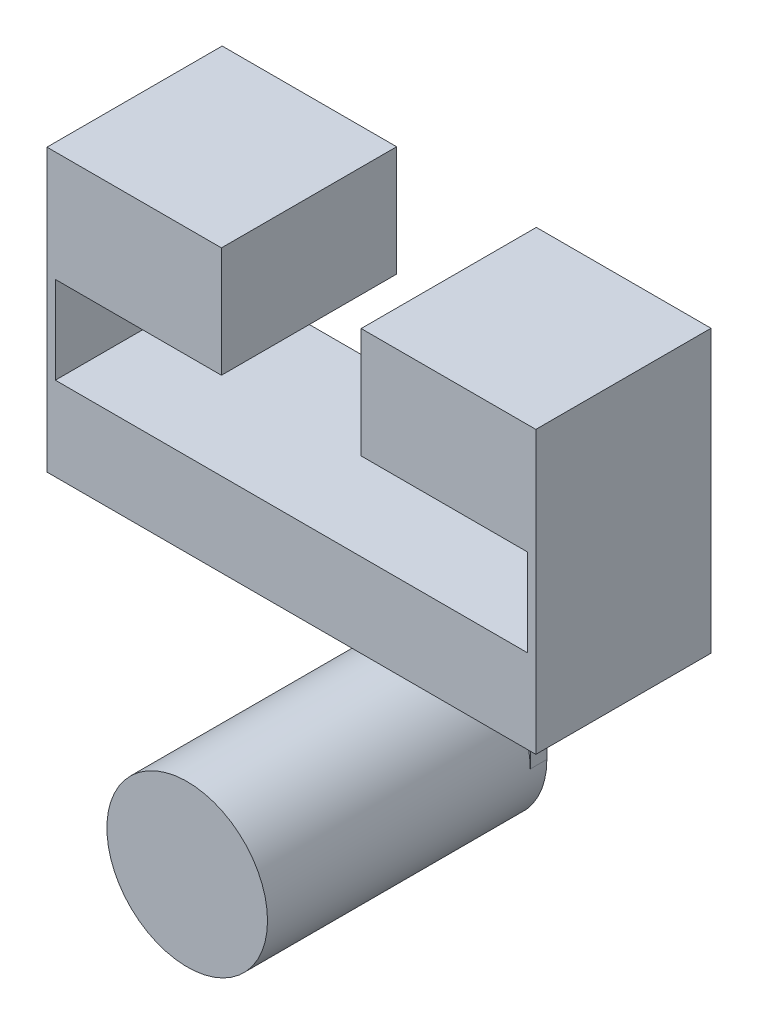
ISO-10303-21;
HEADER;
FILE_DESCRIPTION(('STEP AP214'),'2;1');
FILE_NAME('part.step','',(''),(''),'','','');
FILE_SCHEMA(('AUTOMOTIVE_DESIGN { 1 0 10303 214 1 1 1 1 }'));
ENDSEC;
DATA;
#1=APPLICATION_CONTEXT('core data for automotive mechanical design processes');
#2=APPLICATION_PROTOCOL_DEFINITION('international standard','automotive_design',2000,#1);
#3=PRODUCT_CONTEXT('',#1,'mechanical');
#4=PRODUCT('Part','Part','',(#3));
#5=PRODUCT_RELATED_PRODUCT_CATEGORY('part','',(#4));
#6=PRODUCT_DEFINITION_FORMATION('','',#4);
#7=PRODUCT_DEFINITION_CONTEXT('part definition',#1,'design');
#8=PRODUCT_DEFINITION('design','',#6,#7);
#9=PRODUCT_DEFINITION_SHAPE('','',#8);
#10=(LENGTH_UNIT() NAMED_UNIT(*) SI_UNIT(.MILLI.,.METRE.));
#11=(NAMED_UNIT(*) PLANE_ANGLE_UNIT() SI_UNIT($,.RADIAN.));
#12=(NAMED_UNIT(*) SI_UNIT($,.STERADIAN.) SOLID_ANGLE_UNIT());
#13=UNCERTAINTY_MEASURE_WITH_UNIT(LENGTH_MEASURE(1.E-05),#10,'distance_accuracy_value','');
#14=(GEOMETRIC_REPRESENTATION_CONTEXT(3) GLOBAL_UNCERTAINTY_ASSIGNED_CONTEXT((#13)) GLOBAL_UNIT_ASSIGNED_CONTEXT((#10,
#11,#12)) REPRESENTATION_CONTEXT('',''));
#15=CARTESIAN_POINT('',(0.,0.,0.));
#16=DIRECTION('',(0.,0.,1.));
#17=DIRECTION('',(1.,0.,0.));
#18=AXIS2_PLACEMENT_3D('',#15,#16,#17);
#19=CARTESIAN_POINT('',(0.,0.,-50.8));
#20=DIRECTION('',(0.,0.,1.));
#21=DIRECTION('',(1.,0.,0.));
#22=AXIS2_PLACEMENT_3D('',#19,#20,#21);
#23=CYLINDRICAL_SURFACE('',#22,14.605);
#24=DIRECTION('',(0.,0.,-1.));
#25=VECTOR('',#24,1.);
#26=CARTESIAN_POINT('',(14.605,0.,-47.77994));
#27=LINE('',#26,#25);
#28=CARTESIAN_POINT('',(14.605,0.,-47.77994));
#29=VERTEX_POINT('',#28);
#30=CARTESIAN_POINT('',(14.605,0.,-50.8));
#31=VERTEX_POINT('',#30);
#32=EDGE_CURVE('E310',#29,#31,#27,.T.);
#33=ORIENTED_EDGE('',*,*,#32,.F.);
#34=CARTESIAN_POINT('',(0.,0.,-47.77994));
#35=DIRECTION('',(0.,0.,1.));
#36=DIRECTION('',(1.,0.,0.));
#37=AXIS2_PLACEMENT_3D('',#34,#35,#36);
#38=CIRCLE('',#37,14.605);
#39=CARTESIAN_POINT('',(-14.605,0.,-47.77994));
#40=VERTEX_POINT('',#39);
#41=EDGE_CURVE('E11',#40,#29,#38,.F.);
#42=ORIENTED_EDGE('',*,*,#41,.F.);
#43=DIRECTION('',(0.,0.,-1.));
#44=VECTOR('',#43,1.);
#45=CARTESIAN_POINT('',(-14.605,0.,-47.77994));
#46=LINE('',#45,#44);
#47=CARTESIAN_POINT('',(-14.605,0.,-50.8));
#48=VERTEX_POINT('',#47);
#49=EDGE_CURVE('E325',#40,#48,#46,.T.);
#50=ORIENTED_EDGE('',*,*,#49,.T.);
#51=CARTESIAN_POINT('',(0.,0.,-50.8));
#52=DIRECTION('',(0.,0.,1.));
#53=DIRECTION('',(1.,0.,0.));
#54=AXIS2_PLACEMENT_3D('',#51,#52,#53);
#55=CIRCLE('',#54,14.605);
#56=EDGE_CURVE('E53',#48,#31,#55,.T.);
#57=ORIENTED_EDGE('',*,*,#56,.T.);
#58=EDGE_LOOP('',(#33,#42,#50,#57));
#59=FACE_BOUND('',#58,.T.);
#60=CARTESIAN_POINT('',(0.,0.,0.));
#61=DIRECTION('',(0.,0.,1.));
#62=DIRECTION('',(1.,0.,0.));
#63=AXIS2_PLACEMENT_3D('',#60,#61,#62);
#64=CIRCLE('',#63,14.605);
#65=CARTESIAN_POINT('',(14.605,0.,0.));
#66=VERTEX_POINT('',#65);
#67=EDGE_CURVE('E321',#66,#66,#64,.T.);
#68=ORIENTED_EDGE('',*,*,#67,.F.);
#69=EDGE_LOOP('',(#68));
#70=FACE_BOUND('',#69,.T.);
#71=ADVANCED_FACE('F45',(#59,#70),#23,.T.);
#72=CARTESIAN_POINT('',(0.,0.,-50.8));
#73=DIRECTION('',(0.,0.,1.));
#74=DIRECTION('',(1.,0.,0.));
#75=AXIS2_PLACEMENT_3D('',#72,#73,#74);
#76=PLANE('',#75);
#77=ORIENTED_EDGE('',*,*,#56,.F.);
#78=DIRECTION('',(0.,1.,0.));
#79=VECTOR('',#78,1.);
#80=CARTESIAN_POINT('',(-14.605,0.,-50.8));
#81=LINE('',#80,#79);
#82=CARTESIAN_POINT('',(-14.605,31.6498941974016,-50.8));
#83=VERTEX_POINT('',#82);
#84=EDGE_CURVE('E303',#48,#83,#81,.T.);
#85=ORIENTED_EDGE('',*,*,#84,.T.);
#86=DIRECTION('',(-1.,0.,0.));
#87=VECTOR('',#86,1.);
#88=CARTESIAN_POINT('',(-14.605,31.6498941974016,-50.8));
#89=LINE('',#88,#87);
#90=CARTESIAN_POINT('',(-44.442538051824,31.6498941974016,-50.8));
#91=VERTEX_POINT('',#90);
#92=EDGE_CURVE('E255',#83,#91,#89,.T.);
#93=ORIENTED_EDGE('',*,*,#92,.T.);
#94=DIRECTION('',(0.,-1.,0.));
#95=VECTOR('',#94,1.);
#96=CARTESIAN_POINT('',(-44.442538051824,46.8898941974016,-50.8));
#97=LINE('',#96,#95);
#98=CARTESIAN_POINT('',(-44.442538051824,82.8308941974016,-50.8));
#99=VERTEX_POINT('',#98);
#100=EDGE_CURVE('E168',#99,#91,#97,.T.);
#101=ORIENTED_EDGE('',*,*,#100,.F.);
#102=DIRECTION('',(-1.,0.,0.));
#103=VECTOR('',#102,1.);
#104=CARTESIAN_POINT('',(-44.442538051824,82.8308941974016,-50.8));
#105=LINE('',#104,#103);
#106=CARTESIAN_POINT('',(-12.7158806436872,82.8308941974016,-50.8));
#107=VERTEX_POINT('',#106);
#108=EDGE_CURVE('E184',#107,#99,#105,.T.);
#109=ORIENTED_EDGE('',*,*,#108,.F.);
#110=DIRECTION('',(0.,-1.,0.));
#111=VECTOR('',#110,1.);
#112=CARTESIAN_POINT('',(-12.7158806436872,82.8308941974016,-50.8));
#113=LINE('',#112,#111);
#114=CARTESIAN_POINT('',(-12.7158806436872,62.7648941974016,-50.8));
#115=VERTEX_POINT('',#114);
#116=EDGE_CURVE('E197',#107,#115,#113,.T.);
#117=ORIENTED_EDGE('',*,*,#116,.T.);
#118=DIRECTION('',(-1.,0.,0.));
#119=VECTOR('',#118,1.);
#120=CARTESIAN_POINT('',(-44.442538051824,62.7648941974016,-50.8));
#121=LINE('',#120,#119);
#122=CARTESIAN_POINT('',(-42.918538051824,62.7648941974016,-50.8));
#123=VERTEX_POINT('',#122);
#124=EDGE_CURVE('E186',#115,#123,#121,.T.);
#125=ORIENTED_EDGE('',*,*,#124,.T.);
#126=DIRECTION('',(0.,-1.,0.));
#127=VECTOR('',#126,1.);
#128=CARTESIAN_POINT('',(-42.918538051824,62.7648941974016,-50.8));
#129=LINE('',#128,#127);
#130=CARTESIAN_POINT('',(-42.918538051824,46.8898941974016,-50.8));
#131=VERTEX_POINT('',#130);
#132=EDGE_CURVE('E259',#123,#131,#129,.T.);
#133=ORIENTED_EDGE('',*,*,#132,.T.);
#134=DIRECTION('',(-1.,0.,0.));
#135=VECTOR('',#134,1.);
#136=CARTESIAN_POINT('',(44.457461948176,46.8898941974016,-50.8));
#137=LINE('',#136,#135);
#138=CARTESIAN_POINT('',(42.933461948176,46.8898941974016,-50.8));
#139=VERTEX_POINT('',#138);
#140=EDGE_CURVE('E269',#139,#131,#137,.T.);
#141=ORIENTED_EDGE('',*,*,#140,.F.);
#142=DIRECTION('',(0.,-1.,0.));
#143=VECTOR('',#142,1.);
#144=CARTESIAN_POINT('',(42.933461948176,62.7648941974016,-50.8));
#145=LINE('',#144,#143);
#146=CARTESIAN_POINT('',(42.933461948176,62.7648941974016,-50.8));
#147=VERTEX_POINT('',#146);
#148=EDGE_CURVE('E251',#147,#139,#145,.T.);
#149=ORIENTED_EDGE('',*,*,#148,.F.);
#150=DIRECTION('',(-1.,0.,0.));
#151=VECTOR('',#150,1.);
#152=CARTESIAN_POINT('',(44.457461948176,62.7648941974016,-50.8));
#153=LINE('',#152,#151);
#154=CARTESIAN_POINT('',(12.6898275912732,62.7648941974016,-50.8));
#155=VERTEX_POINT('',#154);
#156=EDGE_CURVE('E201',#147,#155,#153,.T.);
#157=ORIENTED_EDGE('',*,*,#156,.T.);
#158=DIRECTION('',(0.,-1.,0.));
#159=VECTOR('',#158,1.);
#160=CARTESIAN_POINT('',(12.6898275912732,82.8308941974016,-50.8));
#161=LINE('',#160,#159);
#162=CARTESIAN_POINT('',(12.6898275912732,82.8308941974016,-50.8));
#163=VERTEX_POINT('',#162);
#164=EDGE_CURVE('E210',#163,#155,#161,.T.);
#165=ORIENTED_EDGE('',*,*,#164,.F.);
#166=DIRECTION('',(-1.,0.,0.));
#167=VECTOR('',#166,1.);
#168=CARTESIAN_POINT('',(44.457461948176,82.8308941974016,-50.8));
#169=LINE('',#168,#167);
#170=CARTESIAN_POINT('',(44.457461948176,82.8308941974016,-50.8));
#171=VERTEX_POINT('',#170);
#172=EDGE_CURVE('E235',#171,#163,#169,.T.);
#173=ORIENTED_EDGE('',*,*,#172,.F.);
#174=DIRECTION('',(0.,-1.,0.));
#175=VECTOR('',#174,1.);
#176=CARTESIAN_POINT('',(44.457461948176,46.8898941974016,-50.8));
#177=LINE('',#176,#175);
#178=CARTESIAN_POINT('',(44.457461948176,31.6498941974016,-50.8));
#179=VERTEX_POINT('',#178);
#180=EDGE_CURVE('E276',#171,#179,#177,.T.);
#181=ORIENTED_EDGE('',*,*,#180,.T.);
#182=CARTESIAN_POINT('',(14.605,31.6498941974016,-50.8));
#183=VERTEX_POINT('',#182);
#184=EDGE_CURVE('E277',#179,#183,#89,.T.);
#185=ORIENTED_EDGE('',*,*,#184,.T.);
#186=DIRECTION('',(0.,-1.,0.));
#187=VECTOR('',#186,1.);
#188=CARTESIAN_POINT('',(14.605,0.,-50.8));
#189=LINE('',#188,#187);
#190=EDGE_CURVE('E297',#183,#31,#189,.T.);
#191=ORIENTED_EDGE('',*,*,#190,.T.);
#192=EDGE_LOOP('',(#77,#85,#93,#101,#109,#117,#125,#133,#141,#149,#157,#165,#173,#181,#185,#191));
#193=FACE_BOUND('',#192,.T.);
#194=ADVANCED_FACE('F340',(#193),#76,.F.);
#195=CARTESIAN_POINT('',(0.,0.,0.));
#196=DIRECTION('',(0.,0.,1.));
#197=DIRECTION('',(1.,0.,0.));
#198=AXIS2_PLACEMENT_3D('',#195,#196,#197);
#199=PLANE('',#198);
#200=ORIENTED_EDGE('',*,*,#67,.T.);
#201=EDGE_LOOP('',(#200));
#202=FACE_BOUND('',#201,.T.);
#203=ADVANCED_FACE('F337',(#202),#199,.T.);
#204=CARTESIAN_POINT('',(14.605,0.,-47.77994));
#205=DIRECTION('',(1.,0.,0.));
#206=DIRECTION('',(0.,0.,-1.));
#207=AXIS2_PLACEMENT_3D('',#204,#205,#206);
#208=PLANE('',#207);
#209=ORIENTED_EDGE('',*,*,#190,.F.);
#210=DIRECTION('',(0.,0.,-1.));
#211=VECTOR('',#210,1.);
#212=CARTESIAN_POINT('',(14.605,31.6498941974016,-47.77994));
#213=LINE('',#212,#211);
#214=CARTESIAN_POINT('',(14.605,31.6498941974016,-47.77994));
#215=VERTEX_POINT('',#214);
#216=EDGE_CURVE('E317',#215,#183,#213,.T.);
#217=ORIENTED_EDGE('',*,*,#216,.F.);
#218=DIRECTION('',(0.,-1.,0.));
#219=VECTOR('',#218,1.);
#220=CARTESIAN_POINT('',(14.605,0.,-47.77994));
#221=LINE('',#220,#219);
#222=EDGE_CURVE('E298',#215,#29,#221,.T.);
#223=ORIENTED_EDGE('',*,*,#222,.T.);
#224=ORIENTED_EDGE('',*,*,#32,.T.);
#225=EDGE_LOOP('',(#209,#217,#223,#224));
#226=FACE_BOUND('',#225,.T.);
#227=ADVANCED_FACE('F356',(#226),#208,.T.);
#228=CARTESIAN_POINT('',(-14.605,0.,-47.77994));
#229=DIRECTION('',(-1.,0.,0.));
#230=DIRECTION('',(0.,0.,1.));
#231=AXIS2_PLACEMENT_3D('',#228,#229,#230);
#232=PLANE('',#231);
#233=ORIENTED_EDGE('',*,*,#84,.F.);
#234=ORIENTED_EDGE('',*,*,#49,.F.);
#235=DIRECTION('',(0.,1.,0.));
#236=VECTOR('',#235,1.);
#237=CARTESIAN_POINT('',(-14.605,0.,-47.77994));
#238=LINE('',#237,#236);
#239=CARTESIAN_POINT('',(-14.605,31.6498941974016,-47.77994));
#240=VERTEX_POINT('',#239);
#241=EDGE_CURVE('E302',#40,#240,#238,.T.);
#242=ORIENTED_EDGE('',*,*,#241,.T.);
#243=DIRECTION('',(0.,0.,-1.));
#244=VECTOR('',#243,1.);
#245=CARTESIAN_POINT('',(-14.605,31.6498941974016,-47.77994));
#246=LINE('',#245,#244);
#247=EDGE_CURVE('E322',#240,#83,#246,.T.);
#248=ORIENTED_EDGE('',*,*,#247,.T.);
#249=EDGE_LOOP('',(#233,#234,#242,#248));
#250=FACE_BOUND('',#249,.T.);
#251=ADVANCED_FACE('F396',(#250),#232,.T.);
#252=CARTESIAN_POINT('',(0.,0.,-47.77994));
#253=DIRECTION('',(0.,0.,1.));
#254=DIRECTION('',(1.,0.,0.));
#255=AXIS2_PLACEMENT_3D('',#252,#253,#254);
#256=PLANE('',#255);
#257=ORIENTED_EDGE('',*,*,#241,.F.);
#258=ORIENTED_EDGE('',*,*,#41,.T.);
#259=ORIENTED_EDGE('',*,*,#222,.F.);
#260=DIRECTION('',(1.,0.,0.));
#261=VECTOR('',#260,1.);
#262=CARTESIAN_POINT('',(14.605,31.6498941974016,-47.77994));
#263=LINE('',#262,#261);
#264=EDGE_CURVE('E306',#240,#215,#263,.T.);
#265=ORIENTED_EDGE('',*,*,#264,.F.);
#266=EDGE_LOOP('',(#257,#258,#259,#265));
#267=FACE_BOUND('',#266,.T.);
#268=ADVANCED_FACE('F354',(#267),#256,.T.);
#269=CARTESIAN_POINT('',(-44.442538051824,46.8898941974016,-50.8));
#270=DIRECTION('',(1.,0.,0.));
#271=DIRECTION('',(0.,0.,-1.));
#272=AXIS2_PLACEMENT_3D('',#269,#270,#271);
#273=PLANE('',#272);
#274=DIRECTION('',(0.,0.,1.));
#275=VECTOR('',#274,1.);
#276=CARTESIAN_POINT('',(-44.442538051824,31.6498941974016,-50.8));
#277=LINE('',#276,#275);
#278=CARTESIAN_POINT('',(-44.442538051824,31.6498941974016,-18.9419777794111));
#279=VERTEX_POINT('',#278);
#280=EDGE_CURVE('E164',#91,#279,#277,.T.);
#281=ORIENTED_EDGE('',*,*,#280,.T.);
#282=DIRECTION('',(0.,-1.,0.));
#283=VECTOR('',#282,1.);
#284=CARTESIAN_POINT('',(-44.442538051824,46.8898941974016,-18.9419777794111));
#285=LINE('',#284,#283);
#286=CARTESIAN_POINT('',(-44.442538051824,82.8308941974016,-18.9419777794111));
#287=VERTEX_POINT('',#286);
#288=EDGE_CURVE('E157',#287,#279,#285,.T.);
#289=ORIENTED_EDGE('',*,*,#288,.F.);
#290=DIRECTION('',(0.,0.,1.));
#291=VECTOR('',#290,1.);
#292=CARTESIAN_POINT('',(-44.442538051824,82.8308941974016,-18.9419777794111));
#293=LINE('',#292,#291);
#294=EDGE_CURVE('E162',#99,#287,#293,.T.);
#295=ORIENTED_EDGE('',*,*,#294,.F.);
#296=ORIENTED_EDGE('',*,*,#100,.T.);
#297=EDGE_LOOP('',(#281,#289,#295,#296));
#298=FACE_BOUND('',#297,.T.);
#299=ADVANCED_FACE('F159',(#298),#273,.F.);
#300=CARTESIAN_POINT('',(-44.442538051824,46.8898941974016,-18.9419777794111));
#301=DIRECTION('',(0.,0.,-1.));
#302=DIRECTION('',(-1.,0.,0.));
#303=AXIS2_PLACEMENT_3D('',#300,#301,#302);
#304=PLANE('',#303);
#305=DIRECTION('',(1.,0.,0.));
#306=VECTOR('',#305,1.);
#307=CARTESIAN_POINT('',(-44.442538051824,31.6498941974016,-18.9419777794111));
#308=LINE('',#307,#306);
#309=CARTESIAN_POINT('',(44.457461948176,31.6498941974016,-18.9419777794111));
#310=VERTEX_POINT('',#309);
#311=EDGE_CURVE('E283',#279,#310,#308,.T.);
#312=ORIENTED_EDGE('',*,*,#311,.T.);
#313=DIRECTION('',(0.,-1.,0.));
#314=VECTOR('',#313,1.);
#315=CARTESIAN_POINT('',(44.457461948176,46.8898941974016,-18.9419777794111));
#316=LINE('',#315,#314);
#317=CARTESIAN_POINT('',(44.457461948176,82.8308941974016,-18.9419777794111));
#318=VERTEX_POINT('',#317);
#319=EDGE_CURVE('E169',#318,#310,#316,.T.);
#320=ORIENTED_EDGE('',*,*,#319,.F.);
#321=DIRECTION('',(1.,0.,0.));
#322=VECTOR('',#321,1.);
#323=CARTESIAN_POINT('',(12.6898275912732,82.8308941974016,-18.9419777794111));
#324=LINE('',#323,#322);
#325=CARTESIAN_POINT('',(12.6898275912732,82.8308941974016,-18.9419777794111));
#326=VERTEX_POINT('',#325);
#327=EDGE_CURVE('E218',#326,#318,#324,.T.);
#328=ORIENTED_EDGE('',*,*,#327,.F.);
#329=DIRECTION('',(0.,-1.,0.));
#330=VECTOR('',#329,1.);
#331=CARTESIAN_POINT('',(12.6898275912732,82.8308941974016,-18.9419777794111));
#332=LINE('',#331,#330);
#333=CARTESIAN_POINT('',(12.6898275912732,62.7648941974016,-18.9419777794111));
#334=VERTEX_POINT('',#333);
#335=EDGE_CURVE('E214',#326,#334,#332,.T.);
#336=ORIENTED_EDGE('',*,*,#335,.T.);
#337=DIRECTION('',(1.,0.,0.));
#338=VECTOR('',#337,1.);
#339=CARTESIAN_POINT('',(12.6898275912732,62.7648941974016,-18.9419777794111));
#340=LINE('',#339,#338);
#341=CARTESIAN_POINT('',(42.933461948176,62.7648941974016,-18.9419777794111));
#342=VERTEX_POINT('',#341);
#343=EDGE_CURVE('E219',#334,#342,#340,.T.);
#344=ORIENTED_EDGE('',*,*,#343,.T.);
#345=DIRECTION('',(0.,-1.,0.));
#346=VECTOR('',#345,1.);
#347=CARTESIAN_POINT('',(42.933461948176,62.7648941974016,-18.9419777794111));
#348=LINE('',#347,#346);
#349=CARTESIAN_POINT('',(42.933461948176,46.8898941974016,-18.9419777794111));
#350=VERTEX_POINT('',#349);
#351=EDGE_CURVE('E245',#342,#350,#348,.T.);
#352=ORIENTED_EDGE('',*,*,#351,.T.);
#353=DIRECTION('',(1.,0.,0.));
#354=VECTOR('',#353,1.);
#355=CARTESIAN_POINT('',(-44.442538051824,46.8898941974016,-18.9419777794111));
#356=LINE('',#355,#354);
#357=CARTESIAN_POINT('',(-42.918538051824,46.8898941974016,-18.9419777794111));
#358=VERTEX_POINT('',#357);
#359=EDGE_CURVE('E272',#358,#350,#356,.T.);
#360=ORIENTED_EDGE('',*,*,#359,.F.);
#361=DIRECTION('',(0.,-1.,0.));
#362=VECTOR('',#361,1.);
#363=CARTESIAN_POINT('',(-42.918538051824,62.7648941974016,-18.9419777794111));
#364=LINE('',#363,#362);
#365=CARTESIAN_POINT('',(-42.918538051824,62.7648941974016,-18.9419777794111));
#366=VERTEX_POINT('',#365);
#367=EDGE_CURVE('E209',#366,#358,#364,.T.);
#368=ORIENTED_EDGE('',*,*,#367,.F.);
#369=DIRECTION('',(1.,0.,0.));
#370=VECTOR('',#369,1.);
#371=CARTESIAN_POINT('',(-12.7158806436872,62.7648941974016,-18.9419777794111));
#372=LINE('',#371,#370);
#373=CARTESIAN_POINT('',(-12.7158806436872,62.7648941974016,-18.9419777794111));
#374=VERTEX_POINT('',#373);
#375=EDGE_CURVE('E198',#366,#374,#372,.T.);
#376=ORIENTED_EDGE('',*,*,#375,.T.);
#377=DIRECTION('',(0.,-1.,0.));
#378=VECTOR('',#377,1.);
#379=CARTESIAN_POINT('',(-12.7158806436872,82.8308941974016,-18.9419777794111));
#380=LINE('',#379,#378);
#381=CARTESIAN_POINT('',(-12.7158806436872,82.8308941974016,-18.9419777794111));
#382=VERTEX_POINT('',#381);
#383=EDGE_CURVE('E175',#382,#374,#380,.T.);
#384=ORIENTED_EDGE('',*,*,#383,.F.);
#385=DIRECTION('',(1.,0.,0.));
#386=VECTOR('',#385,1.);
#387=CARTESIAN_POINT('',(-12.7158806436872,82.8308941974016,-18.9419777794111));
#388=LINE('',#387,#386);
#389=EDGE_CURVE('E172',#287,#382,#388,.T.);
#390=ORIENTED_EDGE('',*,*,#389,.F.);
#391=ORIENTED_EDGE('',*,*,#288,.T.);
#392=EDGE_LOOP('',(#312,#320,#328,#336,#344,#352,#360,#368,#376,#384,#390,#391));
#393=FACE_BOUND('',#392,.T.);
#394=ADVANCED_FACE('F173',(#393),#304,.F.);
#395=CARTESIAN_POINT('',(44.457461948176,46.8898941974016,-18.9419777794111));
#396=DIRECTION('',(-1.,0.,0.));
#397=DIRECTION('',(0.,0.,1.));
#398=AXIS2_PLACEMENT_3D('',#395,#396,#397);
#399=PLANE('',#398);
#400=DIRECTION('',(0.,0.,-1.));
#401=VECTOR('',#400,1.);
#402=CARTESIAN_POINT('',(44.457461948176,31.6498941974016,-18.9419777794111));
#403=LINE('',#402,#401);
#404=EDGE_CURVE('E273',#310,#179,#403,.T.);
#405=ORIENTED_EDGE('',*,*,#404,.T.);
#406=ORIENTED_EDGE('',*,*,#180,.F.);
#407=DIRECTION('',(0.,0.,-1.));
#408=VECTOR('',#407,1.);
#409=CARTESIAN_POINT('',(44.457461948176,82.8308941974016,-18.9419777794111));
#410=LINE('',#409,#408);
#411=EDGE_CURVE('E224',#318,#171,#410,.T.);
#412=ORIENTED_EDGE('',*,*,#411,.F.);
#413=ORIENTED_EDGE('',*,*,#319,.T.);
#414=EDGE_LOOP('',(#405,#406,#412,#413));
#415=FACE_BOUND('',#414,.T.);
#416=ADVANCED_FACE('F365',(#415),#399,.F.);
#417=CARTESIAN_POINT('',(0.,46.8898941974016,0.));
#418=DIRECTION('',(0.,1.,0.));
#419=DIRECTION('',(0.,0.,1.));
#420=AXIS2_PLACEMENT_3D('',#417,#418,#419);
#421=PLANE('',#420);
#422=DIRECTION('',(0.,0.,1.));
#423=VECTOR('',#422,1.);
#424=CARTESIAN_POINT('',(42.933461948176,46.8898941974016,-50.8));
#425=LINE('',#424,#423);
#426=EDGE_CURVE('E65',#139,#350,#425,.T.);
#427=ORIENTED_EDGE('',*,*,#426,.F.);
#428=ORIENTED_EDGE('',*,*,#140,.T.);
#429=DIRECTION('',(0.,0.,-1.));
#430=VECTOR('',#429,1.);
#431=CARTESIAN_POINT('',(-42.918538051824,46.8898941974016,-18.9419777794111));
#432=LINE('',#431,#430);
#433=EDGE_CURVE('E60',#358,#131,#432,.T.);
#434=ORIENTED_EDGE('',*,*,#433,.F.);
#435=ORIENTED_EDGE('',*,*,#359,.T.);
#436=EDGE_LOOP('',(#427,#428,#434,#435));
#437=FACE_BOUND('',#436,.T.);
#438=ADVANCED_FACE('F443',(#437),#421,.T.);
#439=CARTESIAN_POINT('',(0.,31.6498941974016,0.));
#440=DIRECTION('',(0.,1.,0.));
#441=DIRECTION('',(0.,0.,1.));
#442=AXIS2_PLACEMENT_3D('',#439,#440,#441);
#443=PLANE('',#442);
#444=ORIENTED_EDGE('',*,*,#247,.F.);
#445=ORIENTED_EDGE('',*,*,#264,.T.);
#446=ORIENTED_EDGE('',*,*,#216,.T.);
#447=ORIENTED_EDGE('',*,*,#184,.F.);
#448=ORIENTED_EDGE('',*,*,#404,.F.);
#449=ORIENTED_EDGE('',*,*,#311,.F.);
#450=ORIENTED_EDGE('',*,*,#280,.F.);
#451=ORIENTED_EDGE('',*,*,#92,.F.);
#452=EDGE_LOOP('',(#444,#445,#446,#447,#448,#449,#450,#451));
#453=FACE_BOUND('',#452,.T.);
#454=ADVANCED_FACE('F359',(#453),#443,.F.);
#455=CARTESIAN_POINT('',(-42.918538051824,62.7648941974016,-18.9419777794111));
#456=DIRECTION('',(-1.,0.,0.));
#457=DIRECTION('',(0.,0.,1.));
#458=AXIS2_PLACEMENT_3D('',#455,#456,#457);
#459=PLANE('',#458);
#460=ORIENTED_EDGE('',*,*,#433,.T.);
#461=ORIENTED_EDGE('',*,*,#132,.F.);
#462=DIRECTION('',(0.,0.,-1.));
#463=VECTOR('',#462,1.);
#464=CARTESIAN_POINT('',(-42.918538051824,62.7648941974016,-18.9419777794111));
#465=LINE('',#464,#463);
#466=EDGE_CURVE('E263',#366,#123,#465,.T.);
#467=ORIENTED_EDGE('',*,*,#466,.F.);
#468=ORIENTED_EDGE('',*,*,#367,.T.);
#469=EDGE_LOOP('',(#460,#461,#467,#468));
#470=FACE_BOUND('',#469,.T.);
#471=ADVANCED_FACE('F384',(#470),#459,.F.);
#472=CARTESIAN_POINT('',(42.933461948176,62.7648941974016,-50.8));
#473=DIRECTION('',(1.,0.,0.));
#474=DIRECTION('',(0.,0.,-1.));
#475=AXIS2_PLACEMENT_3D('',#472,#473,#474);
#476=PLANE('',#475);
#477=ORIENTED_EDGE('',*,*,#426,.T.);
#478=ORIENTED_EDGE('',*,*,#351,.F.);
#479=DIRECTION('',(0.,0.,1.));
#480=VECTOR('',#479,1.);
#481=CARTESIAN_POINT('',(42.933461948176,62.7648941974016,-50.8));
#482=LINE('',#481,#480);
#483=EDGE_CURVE('E241',#147,#342,#482,.T.);
#484=ORIENTED_EDGE('',*,*,#483,.F.);
#485=ORIENTED_EDGE('',*,*,#148,.T.);
#486=EDGE_LOOP('',(#477,#478,#484,#485));
#487=FACE_BOUND('',#486,.T.);
#488=ADVANCED_FACE('F381',(#487),#476,.F.);
#489=CARTESIAN_POINT('',(0.,62.7648941974016,0.));
#490=DIRECTION('',(0.,1.,0.));
#491=DIRECTION('',(0.,0.,1.));
#492=AXIS2_PLACEMENT_3D('',#489,#490,#491);
#493=PLANE('',#492);
#494=ORIENTED_EDGE('',*,*,#156,.F.);
#495=ORIENTED_EDGE('',*,*,#483,.T.);
#496=ORIENTED_EDGE('',*,*,#343,.F.);
#497=DIRECTION('',(0.,0.,1.));
#498=VECTOR('',#497,1.);
#499=CARTESIAN_POINT('',(12.6898275912732,62.7648941974016,-50.8));
#500=LINE('',#499,#498);
#501=EDGE_CURVE('E223',#155,#334,#500,.T.);
#502=ORIENTED_EDGE('',*,*,#501,.F.);
#503=EDGE_LOOP('',(#494,#495,#496,#502));
#504=FACE_BOUND('',#503,.T.);
#505=ADVANCED_FACE('F378',(#504),#493,.F.);
#506=CARTESIAN_POINT('',(12.6898275912732,82.8308941974016,-50.8));
#507=DIRECTION('',(1.,0.,0.));
#508=DIRECTION('',(0.,0.,-1.));
#509=AXIS2_PLACEMENT_3D('',#506,#507,#508);
#510=PLANE('',#509);
#511=ORIENTED_EDGE('',*,*,#501,.T.);
#512=ORIENTED_EDGE('',*,*,#335,.F.);
#513=DIRECTION('',(0.,0.,1.));
#514=VECTOR('',#513,1.);
#515=CARTESIAN_POINT('',(12.6898275912732,82.8308941974016,-50.8));
#516=LINE('',#515,#514);
#517=EDGE_CURVE('E232',#163,#326,#516,.T.);
#518=ORIENTED_EDGE('',*,*,#517,.F.);
#519=ORIENTED_EDGE('',*,*,#164,.T.);
#520=EDGE_LOOP('',(#511,#512,#518,#519));
#521=FACE_BOUND('',#520,.T.);
#522=ADVANCED_FACE('F373',(#521),#510,.F.);
#523=CARTESIAN_POINT('',(0.,82.8308941974016,0.));
#524=DIRECTION('',(0.,1.,0.));
#525=DIRECTION('',(0.,0.,1.));
#526=AXIS2_PLACEMENT_3D('',#523,#524,#525);
#527=PLANE('',#526);
#528=ORIENTED_EDGE('',*,*,#411,.T.);
#529=ORIENTED_EDGE('',*,*,#172,.T.);
#530=ORIENTED_EDGE('',*,*,#517,.T.);
#531=ORIENTED_EDGE('',*,*,#327,.T.);
#532=EDGE_LOOP('',(#528,#529,#530,#531));
#533=FACE_BOUND('',#532,.T.);
#534=ADVANCED_FACE('F369',(#533),#527,.T.);
#535=CARTESIAN_POINT('',(0.,62.7648941974016,0.));
#536=DIRECTION('',(0.,-1.,0.));
#537=DIRECTION('',(0.,0.,-1.));
#538=AXIS2_PLACEMENT_3D('',#535,#536,#537);
#539=PLANE('',#538);
#540=ORIENTED_EDGE('',*,*,#466,.T.);
#541=ORIENTED_EDGE('',*,*,#124,.F.);
#542=DIRECTION('',(0.,0.,-1.));
#543=VECTOR('',#542,1.);
#544=CARTESIAN_POINT('',(-12.7158806436872,62.7648941974016,-50.8));
#545=LINE('',#544,#543);
#546=EDGE_CURVE('E190',#374,#115,#545,.T.);
#547=ORIENTED_EDGE('',*,*,#546,.F.);
#548=ORIENTED_EDGE('',*,*,#375,.F.);
#549=EDGE_LOOP('',(#540,#541,#547,#548));
#550=FACE_BOUND('',#549,.T.);
#551=ADVANCED_FACE('F389',(#550),#539,.T.);
#552=CARTESIAN_POINT('',(-12.7158806436872,82.8308941974016,-50.8));
#553=DIRECTION('',(-1.,0.,0.));
#554=DIRECTION('',(0.,0.,1.));
#555=AXIS2_PLACEMENT_3D('',#552,#553,#554);
#556=PLANE('',#555);
#557=ORIENTED_EDGE('',*,*,#546,.T.);
#558=ORIENTED_EDGE('',*,*,#116,.F.);
#559=DIRECTION('',(0.,0.,-1.));
#560=VECTOR('',#559,1.);
#561=CARTESIAN_POINT('',(-12.7158806436872,82.8308941974016,-50.8));
#562=LINE('',#561,#560);
#563=EDGE_CURVE('E179',#382,#107,#562,.T.);
#564=ORIENTED_EDGE('',*,*,#563,.F.);
#565=ORIENTED_EDGE('',*,*,#383,.T.);
#566=EDGE_LOOP('',(#557,#558,#564,#565));
#567=FACE_BOUND('',#566,.T.);
#568=ADVANCED_FACE('F391',(#567),#556,.F.);
#569=CARTESIAN_POINT('',(0.,82.8308941974016,0.));
#570=DIRECTION('',(0.,-1.,0.));
#571=DIRECTION('',(0.,0.,-1.));
#572=AXIS2_PLACEMENT_3D('',#569,#570,#571);
#573=PLANE('',#572);
#574=ORIENTED_EDGE('',*,*,#294,.T.);
#575=ORIENTED_EDGE('',*,*,#389,.T.);
#576=ORIENTED_EDGE('',*,*,#563,.T.);
#577=ORIENTED_EDGE('',*,*,#108,.T.);
#578=EDGE_LOOP('',(#574,#575,#576,#577));
#579=FACE_BOUND('',#578,.T.);
#580=ADVANCED_FACE('F182',(#579),#573,.F.);
#581=CLOSED_SHELL('',(#71,#194,#203,#227,#251,#268,#299,#394,#416,#438,#454,#471,#488,#505,#522,
#534,#551,#568,#580));
#582=MANIFOLD_SOLID_BREP('B2',#581);
#583=ADVANCED_BREP_SHAPE_REPRESENTATION('',(#18,#582),#14);
#584=SHAPE_DEFINITION_REPRESENTATION(#9,#583);
ENDSEC;
END-ISO-10303-21;
